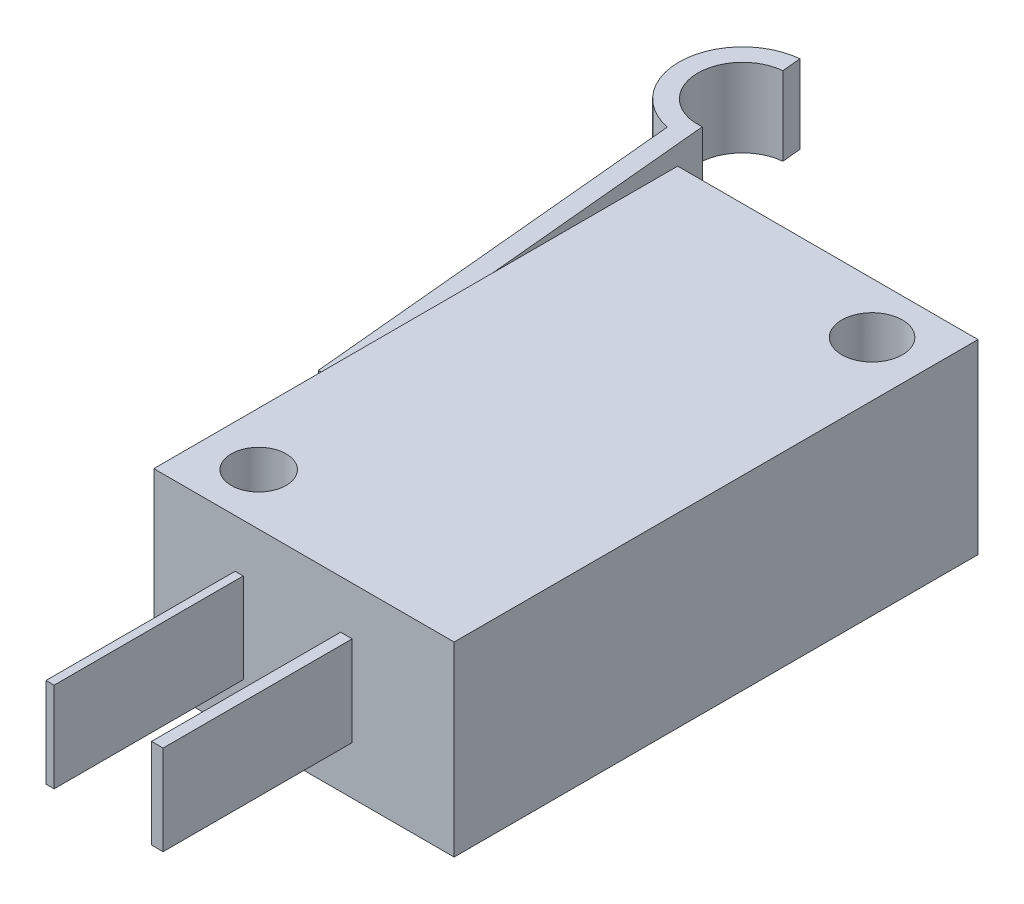
ISO-10303-21;
HEADER;
FILE_DESCRIPTION(('STEP AP214'),'2;1');
FILE_NAME('part.step','',(''),(''),'','','');
FILE_SCHEMA(('AUTOMOTIVE_DESIGN { 1 0 10303 214 1 1 1 1 }'));
ENDSEC;
DATA;
#1=APPLICATION_CONTEXT('core data for automotive mechanical design processes');
#2=APPLICATION_PROTOCOL_DEFINITION('international standard','automotive_design',2000,#1);
#3=PRODUCT_CONTEXT('',#1,'mechanical');
#4=PRODUCT('Part','Part','',(#3));
#5=PRODUCT_RELATED_PRODUCT_CATEGORY('part','',(#4));
#6=PRODUCT_DEFINITION_FORMATION('','',#4);
#7=PRODUCT_DEFINITION_CONTEXT('part definition',#1,'design');
#8=PRODUCT_DEFINITION('design','',#6,#7);
#9=PRODUCT_DEFINITION_SHAPE('','',#8);
#10=(LENGTH_UNIT() NAMED_UNIT(*) SI_UNIT(.MILLI.,.METRE.));
#11=(NAMED_UNIT(*) PLANE_ANGLE_UNIT() SI_UNIT($,.RADIAN.));
#12=(NAMED_UNIT(*) SI_UNIT($,.STERADIAN.) SOLID_ANGLE_UNIT());
#13=UNCERTAINTY_MEASURE_WITH_UNIT(LENGTH_MEASURE(1.E-05),#10,'distance_accuracy_value','');
#14=(GEOMETRIC_REPRESENTATION_CONTEXT(3) GLOBAL_UNCERTAINTY_ASSIGNED_CONTEXT((#13)) GLOBAL_UNIT_ASSIGNED_CONTEXT((#10,
#11,#12)) REPRESENTATION_CONTEXT('',''));
#15=CARTESIAN_POINT('',(0.,0.,0.));
#16=DIRECTION('',(0.,0.,1.));
#17=DIRECTION('',(1.,0.,0.));
#18=AXIS2_PLACEMENT_3D('',#15,#16,#17);
#19=CARTESIAN_POINT('',(-4.22086288071951,2.84999999999997,-35.3521896796628));
#20=DIRECTION('',(0.,1.,0.));
#21=DIRECTION('',(0.,0.,1.));
#22=AXIS2_PLACEMENT_3D('',#19,#20,#21);
#23=CYLINDRICAL_SURFACE('',#22,3.36253607405095);
#24=CARTESIAN_POINT('',(-4.22086288071951,6.99999999999997,-35.3521896796628));
#25=DIRECTION('',(0.,1.,0.));
#26=DIRECTION('',(0.,0.,1.));
#27=AXIS2_PLACEMENT_3D('',#24,#25,#26);
#28=CIRCLE('',#27,3.36253607405095);
#29=CARTESIAN_POINT('',(-4.53521126760563,6.99999999999997,-38.7));
#30=VERTEX_POINT('',#29);
#31=CARTESIAN_POINT('',(-4.91187053398898,6.99999999999998,-32.0614211869826));
#32=VERTEX_POINT('',#31);
#33=EDGE_CURVE('E221',#30,#32,#28,.T.);
#34=ORIENTED_EDGE('',*,*,#33,.F.);
#35=DIRECTION('',(0.,-1.,0.));
#36=VECTOR('',#35,1.);
#37=CARTESIAN_POINT('',(-4.53521126760563,9.85,-38.7));
#38=LINE('',#37,#36);
#39=CARTESIAN_POINT('',(-4.53521126760563,2.84999999999997,-38.7));
#40=VERTEX_POINT('',#39);
#41=EDGE_CURVE('E211',#30,#40,#38,.T.);
#42=ORIENTED_EDGE('',*,*,#41,.T.);
#43=CARTESIAN_POINT('',(-4.22086288071951,2.84999999999997,-35.3521896796628));
#44=DIRECTION('',(0.,1.,0.));
#45=DIRECTION('',(0.,0.,1.));
#46=AXIS2_PLACEMENT_3D('',#43,#44,#45);
#47=CIRCLE('',#46,3.36253607405095);
#48=CARTESIAN_POINT('',(-4.91187053398898,2.84999999999997,-32.0614211869826));
#49=VERTEX_POINT('',#48);
#50=EDGE_CURVE('E219',#40,#49,#47,.T.);
#51=ORIENTED_EDGE('',*,*,#50,.T.);
#52=DIRECTION('',(0.,1.,0.));
#53=VECTOR('',#52,1.);
#54=CARTESIAN_POINT('',(-4.91187053398898,2.84999999999997,-32.0614211869826));
#55=LINE('',#54,#53);
#56=EDGE_CURVE('E242',#32,#49,#55,.F.);
#57=ORIENTED_EDGE('',*,*,#56,.F.);
#58=EDGE_LOOP('',(#34,#42,#51,#57));
#59=FACE_BOUND('',#58,.T.);
#60=ADVANCED_FACE('F68',(#59),#23,.T.);
#61=CARTESIAN_POINT('',(-3.,2.85,-12.7));
#62=DIRECTION('',(0.,0.,1.));
#63=DIRECTION('',(1.,0.,0.));
#64=AXIS2_PLACEMENT_3D('',#61,#62,#63);
#65=PLANE('',#64);
#66=DIRECTION('',(0.,-1.,0.));
#67=VECTOR('',#66,1.);
#68=CARTESIAN_POINT('',(-2.09389671361502,2.85,-12.7));
#69=LINE('',#68,#67);
#70=CARTESIAN_POINT('',(-2.09389671361502,7.,-12.7));
#71=VERTEX_POINT('',#70);
#72=CARTESIAN_POINT('',(-2.09389671361502,2.85,-12.7));
#73=VERTEX_POINT('',#72);
#74=EDGE_CURVE('E90',#71,#73,#69,.T.);
#75=ORIENTED_EDGE('',*,*,#74,.F.);
#76=DIRECTION('',(1.,0.,0.));
#77=VECTOR('',#76,1.);
#78=CARTESIAN_POINT('',(-3.,7.,-12.7));
#79=LINE('',#78,#77);
#80=CARTESIAN_POINT('',(0.,7.,-12.7));
#81=VERTEX_POINT('',#80);
#82=EDGE_CURVE('E265',#71,#81,#79,.T.);
#83=ORIENTED_EDGE('',*,*,#82,.T.);
#84=DIRECTION('',(0.,-1.,0.));
#85=VECTOR('',#84,1.);
#86=CARTESIAN_POINT('',(0.,2.85,-12.7));
#87=LINE('',#86,#85);
#88=CARTESIAN_POINT('',(0.,2.85,-12.7));
#89=VERTEX_POINT('',#88);
#90=EDGE_CURVE('E257',#81,#89,#87,.T.);
#91=ORIENTED_EDGE('',*,*,#90,.T.);
#92=DIRECTION('',(1.,0.,0.));
#93=VECTOR('',#92,1.);
#94=CARTESIAN_POINT('',(-3.,2.85,-12.7));
#95=LINE('',#94,#93);
#96=EDGE_CURVE('E263',#73,#89,#95,.T.);
#97=ORIENTED_EDGE('',*,*,#96,.F.);
#98=EDGE_LOOP('',(#75,#83,#91,#97));
#99=FACE_BOUND('',#98,.T.);
#100=ADVANCED_FACE('F418',(#99),#65,.F.);
#101=CARTESIAN_POINT('',(0.,9.85,0.));
#102=DIRECTION('',(1.,0.,0.));
#103=DIRECTION('',(0.,0.,-1.));
#104=AXIS2_PLACEMENT_3D('',#101,#102,#103);
#105=PLANE('',#104);
#106=DIRECTION('',(0.,0.,1.));
#107=VECTOR('',#106,1.);
#108=CARTESIAN_POINT('',(0.,0.,0.));
#109=LINE('',#108,#107);
#110=CARTESIAN_POINT('',(0.,0.,-27.7));
#111=VERTEX_POINT('',#110);
#112=CARTESIAN_POINT('',(0.,0.,0.));
#113=VERTEX_POINT('',#112);
#114=EDGE_CURVE('E343',#111,#113,#109,.T.);
#115=ORIENTED_EDGE('',*,*,#114,.T.);
#116=DIRECTION('',(0.,-1.,0.));
#117=VECTOR('',#116,1.);
#118=CARTESIAN_POINT('',(0.,9.85,0.));
#119=LINE('',#118,#117);
#120=CARTESIAN_POINT('',(0.,9.85,0.));
#121=VERTEX_POINT('',#120);
#122=EDGE_CURVE('E76',#121,#113,#119,.T.);
#123=ORIENTED_EDGE('',*,*,#122,.F.);
#124=DIRECTION('',(0.,0.,1.));
#125=VECTOR('',#124,1.);
#126=CARTESIAN_POINT('',(0.,9.85,0.));
#127=LINE('',#126,#125);
#128=CARTESIAN_POINT('',(0.,9.85,-27.7));
#129=VERTEX_POINT('',#128);
#130=EDGE_CURVE('E344',#129,#121,#127,.T.);
#131=ORIENTED_EDGE('',*,*,#130,.F.);
#132=DIRECTION('',(0.,-1.,0.));
#133=VECTOR('',#132,1.);
#134=CARTESIAN_POINT('',(0.,9.85,-27.7));
#135=LINE('',#134,#133);
#136=EDGE_CURVE('E354',#129,#111,#135,.T.);
#137=ORIENTED_EDGE('',*,*,#136,.T.);
#138=EDGE_LOOP('',(#115,#123,#131,#137));
#139=FACE_BOUND('',#138,.T.);
#140=DIRECTION('',(0.,1.,0.));
#141=VECTOR('',#140,1.);
#142=CARTESIAN_POINT('',(0.,2.85,-11.7));
#143=LINE('',#142,#141);
#144=CARTESIAN_POINT('',(0.,2.85,-11.7));
#145=VERTEX_POINT('',#144);
#146=CARTESIAN_POINT('',(0.,7.,-11.7));
#147=VERTEX_POINT('',#146);
#148=EDGE_CURVE('E246',#145,#147,#143,.T.);
#149=ORIENTED_EDGE('',*,*,#148,.F.);
#150=DIRECTION('',(0.,0.,1.));
#151=VECTOR('',#150,1.);
#152=CARTESIAN_POINT('',(0.,2.85,-11.7));
#153=LINE('',#152,#151);
#154=EDGE_CURVE('E251',#89,#145,#153,.T.);
#155=ORIENTED_EDGE('',*,*,#154,.F.);
#156=ORIENTED_EDGE('',*,*,#90,.F.);
#157=DIRECTION('',(0.,0.,-1.));
#158=VECTOR('',#157,1.);
#159=CARTESIAN_POINT('',(0.,7.,-11.7));
#160=LINE('',#159,#158);
#161=EDGE_CURVE('E254',#147,#81,#160,.T.);
#162=ORIENTED_EDGE('',*,*,#161,.F.);
#163=EDGE_LOOP('',(#149,#155,#156,#162));
#164=FACE_BOUND('',#163,.T.);
#165=ADVANCED_FACE('F70',(#139,#164),#105,.F.);
#166=CARTESIAN_POINT('',(0.,9.85,0.));
#167=DIRECTION('',(0.,0.,-1.));
#168=DIRECTION('',(-1.,0.,0.));
#169=AXIS2_PLACEMENT_3D('',#166,#167,#168);
#170=PLANE('',#169);
#171=DIRECTION('',(0.,-1.,0.));
#172=VECTOR('',#171,1.);
#173=CARTESIAN_POINT('',(9.88,7.3,0.));
#174=LINE('',#173,#172);
#175=CARTESIAN_POINT('',(9.88,7.3,0.));
#176=VERTEX_POINT('',#175);
#177=CARTESIAN_POINT('',(9.88,2.55,0.));
#178=VERTEX_POINT('',#177);
#179=EDGE_CURVE('E310',#176,#178,#174,.T.);
#180=ORIENTED_EDGE('',*,*,#179,.F.);
#181=DIRECTION('',(-1.,0.,0.));
#182=VECTOR('',#181,1.);
#183=CARTESIAN_POINT('',(9.88,7.3,0.));
#184=LINE('',#183,#182);
#185=CARTESIAN_POINT('',(10.49,7.3,0.));
#186=VERTEX_POINT('',#185);
#187=EDGE_CURVE('E315',#186,#176,#184,.T.);
#188=ORIENTED_EDGE('',*,*,#187,.F.);
#189=DIRECTION('',(0.,1.,0.));
#190=VECTOR('',#189,1.);
#191=CARTESIAN_POINT('',(10.49,7.3,0.));
#192=LINE('',#191,#190);
#193=CARTESIAN_POINT('',(10.49,2.55,0.));
#194=VERTEX_POINT('',#193);
#195=EDGE_CURVE('E327',#194,#186,#192,.T.);
#196=ORIENTED_EDGE('',*,*,#195,.F.);
#197=DIRECTION('',(1.,0.,0.));
#198=VECTOR('',#197,1.);
#199=CARTESIAN_POINT('',(9.88,2.55,0.));
#200=LINE('',#199,#198);
#201=EDGE_CURVE('E324',#178,#194,#200,.T.);
#202=ORIENTED_EDGE('',*,*,#201,.F.);
#203=EDGE_LOOP('',(#180,#188,#196,#202));
#204=FACE_BOUND('',#203,.T.);
#205=DIRECTION('',(1.,0.,0.));
#206=VECTOR('',#205,1.);
#207=CARTESIAN_POINT('',(0.,0.,0.));
#208=LINE('',#207,#206);
#209=CARTESIAN_POINT('',(15.88,0.,0.));
#210=VERTEX_POINT('',#209);
#211=EDGE_CURVE('E357',#113,#210,#208,.T.);
#212=ORIENTED_EDGE('',*,*,#211,.T.);
#213=DIRECTION('',(0.,-1.,0.));
#214=VECTOR('',#213,1.);
#215=CARTESIAN_POINT('',(15.88,9.85,0.));
#216=LINE('',#215,#214);
#217=CARTESIAN_POINT('',(15.88,9.85,0.));
#218=VERTEX_POINT('',#217);
#219=EDGE_CURVE('E367',#218,#210,#216,.T.);
#220=ORIENTED_EDGE('',*,*,#219,.F.);
#221=DIRECTION('',(1.,0.,0.));
#222=VECTOR('',#221,1.);
#223=CARTESIAN_POINT('',(0.,9.85,0.));
#224=LINE('',#223,#222);
#225=EDGE_CURVE('E347',#121,#218,#224,.T.);
#226=ORIENTED_EDGE('',*,*,#225,.F.);
#227=ORIENTED_EDGE('',*,*,#122,.T.);
#228=EDGE_LOOP('',(#212,#220,#226,#227));
#229=FACE_BOUND('',#228,.T.);
#230=DIRECTION('',(0.,1.,0.));
#231=VECTOR('',#230,1.);
#232=CARTESIAN_POINT('',(4.73,7.3,0.));
#233=LINE('',#232,#231);
#234=CARTESIAN_POINT('',(4.73,2.55,0.));
#235=VERTEX_POINT('',#234);
#236=CARTESIAN_POINT('',(4.73,7.3,0.));
#237=VERTEX_POINT('',#236);
#238=EDGE_CURVE('E287',#235,#237,#233,.T.);
#239=ORIENTED_EDGE('',*,*,#238,.F.);
#240=DIRECTION('',(1.,0.,0.));
#241=VECTOR('',#240,1.);
#242=CARTESIAN_POINT('',(4.73,2.55,0.));
#243=LINE('',#242,#241);
#244=CARTESIAN_POINT('',(4.3,2.55,0.));
#245=VERTEX_POINT('',#244);
#246=EDGE_CURVE('E280',#245,#235,#243,.T.);
#247=ORIENTED_EDGE('',*,*,#246,.F.);
#248=DIRECTION('',(0.,-1.,0.));
#249=VECTOR('',#248,1.);
#250=CARTESIAN_POINT('',(4.3,7.3,0.));
#251=LINE('',#250,#249);
#252=CARTESIAN_POINT('',(4.3,7.3,0.));
#253=VERTEX_POINT('',#252);
#254=EDGE_CURVE('E294',#253,#245,#251,.T.);
#255=ORIENTED_EDGE('',*,*,#254,.F.);
#256=DIRECTION('',(-1.,0.,0.));
#257=VECTOR('',#256,1.);
#258=CARTESIAN_POINT('',(4.73,7.3,0.));
#259=LINE('',#258,#257);
#260=EDGE_CURVE('E290',#237,#253,#259,.T.);
#261=ORIENTED_EDGE('',*,*,#260,.F.);
#262=EDGE_LOOP('',(#239,#247,#255,#261));
#263=FACE_BOUND('',#262,.T.);
#264=ADVANCED_FACE('F404',(#204,#229,#263),#170,.F.);
#265=CARTESIAN_POINT('',(15.88,9.85,0.));
#266=DIRECTION('',(-1.,0.,0.));
#267=DIRECTION('',(0.,0.,1.));
#268=AXIS2_PLACEMENT_3D('',#265,#266,#267);
#269=PLANE('',#268);
#270=DIRECTION('',(0.,0.,-1.));
#271=VECTOR('',#270,1.);
#272=CARTESIAN_POINT('',(15.88,0.,0.));
#273=LINE('',#272,#271);
#274=CARTESIAN_POINT('',(15.88,0.,-27.7));
#275=VERTEX_POINT('',#274);
#276=EDGE_CURVE('E359',#210,#275,#273,.T.);
#277=ORIENTED_EDGE('',*,*,#276,.T.);
#278=DIRECTION('',(0.,-1.,0.));
#279=VECTOR('',#278,1.);
#280=CARTESIAN_POINT('',(15.88,9.85,-27.7));
#281=LINE('',#280,#279);
#282=CARTESIAN_POINT('',(15.88,9.85,-27.7));
#283=VERTEX_POINT('',#282);
#284=EDGE_CURVE('E364',#283,#275,#281,.T.);
#285=ORIENTED_EDGE('',*,*,#284,.F.);
#286=DIRECTION('',(0.,0.,-1.));
#287=VECTOR('',#286,1.);
#288=CARTESIAN_POINT('',(15.88,9.85,0.));
#289=LINE('',#288,#287);
#290=EDGE_CURVE('E350',#218,#283,#289,.T.);
#291=ORIENTED_EDGE('',*,*,#290,.F.);
#292=ORIENTED_EDGE('',*,*,#219,.T.);
#293=EDGE_LOOP('',(#277,#285,#291,#292));
#294=FACE_BOUND('',#293,.T.);
#295=ADVANCED_FACE('F401',(#294),#269,.F.);
#296=CARTESIAN_POINT('',(0.,9.85,-27.7));
#297=DIRECTION('',(0.,0.,1.));
#298=DIRECTION('',(1.,0.,0.));
#299=AXIS2_PLACEMENT_3D('',#296,#297,#298);
#300=PLANE('',#299);
#301=DIRECTION('',(-1.,0.,0.));
#302=VECTOR('',#301,1.);
#303=CARTESIAN_POINT('',(0.,0.,-27.7));
#304=LINE('',#303,#302);
#305=EDGE_CURVE('E348',#275,#111,#304,.T.);
#306=ORIENTED_EDGE('',*,*,#305,.T.);
#307=ORIENTED_EDGE('',*,*,#136,.F.);
#308=DIRECTION('',(-1.,0.,0.));
#309=VECTOR('',#308,1.);
#310=CARTESIAN_POINT('',(0.,9.85,-27.7));
#311=LINE('',#310,#309);
#312=EDGE_CURVE('E352',#283,#129,#311,.T.);
#313=ORIENTED_EDGE('',*,*,#312,.F.);
#314=ORIENTED_EDGE('',*,*,#284,.T.);
#315=EDGE_LOOP('',(#306,#307,#313,#314));
#316=FACE_BOUND('',#315,.T.);
#317=ADVANCED_FACE('F397',(#316),#300,.F.);
#318=CARTESIAN_POINT('',(0.,9.85,0.));
#319=DIRECTION('',(0.,-1.,0.));
#320=DIRECTION('',(0.,0.,-1.));
#321=AXIS2_PLACEMENT_3D('',#318,#319,#320);
#322=PLANE('',#321);
#323=CARTESIAN_POINT('',(2.82,9.85,-2.725));
#324=DIRECTION('',(0.,1.,0.));
#325=DIRECTION('',(0.,0.,1.));
#326=AXIS2_PLACEMENT_3D('',#323,#324,#325);
#327=CIRCLE('',#326,1.45);
#328=CARTESIAN_POINT('',(2.82,9.85,-1.275));
#329=VERTEX_POINT('',#328);
#330=EDGE_CURVE('E270',#329,#329,#327,.T.);
#331=ORIENTED_EDGE('',*,*,#330,.F.);
#332=EDGE_LOOP('',(#331));
#333=FACE_BOUND('',#332,.T.);
#334=CARTESIAN_POINT('',(12.98,9.85,-25.));
#335=DIRECTION('',(0.,1.,0.));
#336=DIRECTION('',(0.,0.,1.));
#337=AXIS2_PLACEMENT_3D('',#334,#335,#336);
#338=CIRCLE('',#337,1.6);
#339=CARTESIAN_POINT('',(12.98,9.85,-23.4));
#340=VERTEX_POINT('',#339);
#341=EDGE_CURVE('E269',#340,#340,#338,.T.);
#342=ORIENTED_EDGE('',*,*,#341,.F.);
#343=EDGE_LOOP('',(#342));
#344=FACE_BOUND('',#343,.T.);
#345=ORIENTED_EDGE('',*,*,#130,.T.);
#346=ORIENTED_EDGE('',*,*,#225,.T.);
#347=ORIENTED_EDGE('',*,*,#290,.T.);
#348=ORIENTED_EDGE('',*,*,#312,.T.);
#349=EDGE_LOOP('',(#345,#346,#347,#348));
#350=FACE_BOUND('',#349,.T.);
#351=ADVANCED_FACE('F383',(#333,#344,#350),#322,.F.);
#352=CARTESIAN_POINT('',(0.,0.,0.));
#353=DIRECTION('',(0.,-1.,0.));
#354=DIRECTION('',(0.,0.,-1.));
#355=AXIS2_PLACEMENT_3D('',#352,#353,#354);
#356=PLANE('',#355);
#357=CARTESIAN_POINT('',(2.82,0.,-2.725));
#358=DIRECTION('',(0.,-1.,0.));
#359=DIRECTION('',(0.,0.,-1.));
#360=AXIS2_PLACEMENT_3D('',#357,#358,#359);
#361=CIRCLE('',#360,1.45);
#362=CARTESIAN_POINT('',(2.82,0.,-4.175));
#363=VERTEX_POINT('',#362);
#364=EDGE_CURVE('E291',#363,#363,#361,.T.);
#365=ORIENTED_EDGE('',*,*,#364,.F.);
#366=EDGE_LOOP('',(#365));
#367=FACE_BOUND('',#366,.T.);
#368=CARTESIAN_POINT('',(12.98,0.,-25.));
#369=DIRECTION('',(0.,-1.,0.));
#370=DIRECTION('',(0.,0.,-1.));
#371=AXIS2_PLACEMENT_3D('',#368,#369,#370);
#372=CIRCLE('',#371,1.6);
#373=CARTESIAN_POINT('',(12.98,0.,-26.6));
#374=VERTEX_POINT('',#373);
#375=EDGE_CURVE('E273',#374,#374,#372,.T.);
#376=ORIENTED_EDGE('',*,*,#375,.F.);
#377=EDGE_LOOP('',(#376));
#378=FACE_BOUND('',#377,.T.);
#379=ORIENTED_EDGE('',*,*,#114,.F.);
#380=ORIENTED_EDGE('',*,*,#305,.F.);
#381=ORIENTED_EDGE('',*,*,#276,.F.);
#382=ORIENTED_EDGE('',*,*,#211,.F.);
#383=EDGE_LOOP('',(#379,#380,#381,#382));
#384=FACE_BOUND('',#383,.T.);
#385=ADVANCED_FACE('F379',(#367,#378,#384),#356,.T.);
#386=CARTESIAN_POINT('',(9.88,7.3,10.));
#387=DIRECTION('',(1.,0.,0.));
#388=DIRECTION('',(0.,0.,-1.));
#389=AXIS2_PLACEMENT_3D('',#386,#387,#388);
#390=PLANE('',#389);
#391=ORIENTED_EDGE('',*,*,#179,.T.);
#392=DIRECTION('',(0.,0.,-1.));
#393=VECTOR('',#392,1.);
#394=CARTESIAN_POINT('',(9.88,2.55,10.));
#395=LINE('',#394,#393);
#396=CARTESIAN_POINT('',(9.88,2.55,10.));
#397=VERTEX_POINT('',#396);
#398=EDGE_CURVE('E340',#397,#178,#395,.T.);
#399=ORIENTED_EDGE('',*,*,#398,.F.);
#400=DIRECTION('',(0.,-1.,0.));
#401=VECTOR('',#400,1.);
#402=CARTESIAN_POINT('',(9.88,7.3,10.));
#403=LINE('',#402,#401);
#404=CARTESIAN_POINT('',(9.88,7.3,10.));
#405=VERTEX_POINT('',#404);
#406=EDGE_CURVE('E311',#405,#397,#403,.T.);
#407=ORIENTED_EDGE('',*,*,#406,.F.);
#408=DIRECTION('',(0.,0.,-1.));
#409=VECTOR('',#408,1.);
#410=CARTESIAN_POINT('',(9.88,7.3,10.));
#411=LINE('',#410,#409);
#412=EDGE_CURVE('E321',#405,#176,#411,.T.);
#413=ORIENTED_EDGE('',*,*,#412,.T.);
#414=EDGE_LOOP('',(#391,#399,#407,#413));
#415=FACE_BOUND('',#414,.T.);
#416=ADVANCED_FACE('F382',(#415),#390,.F.);
#417=CARTESIAN_POINT('',(9.88,2.55,10.));
#418=DIRECTION('',(0.,1.,0.));
#419=DIRECTION('',(-1.,0.,0.));
#420=AXIS2_PLACEMENT_3D('',#417,#418,#419);
#421=PLANE('',#420);
#422=ORIENTED_EDGE('',*,*,#201,.T.);
#423=DIRECTION('',(0.,0.,-1.));
#424=VECTOR('',#423,1.);
#425=CARTESIAN_POINT('',(10.49,2.55,10.));
#426=LINE('',#425,#424);
#427=CARTESIAN_POINT('',(10.49,2.55,10.));
#428=VERTEX_POINT('',#427);
#429=EDGE_CURVE('E337',#428,#194,#426,.T.);
#430=ORIENTED_EDGE('',*,*,#429,.F.);
#431=DIRECTION('',(1.,0.,0.));
#432=VECTOR('',#431,1.);
#433=CARTESIAN_POINT('',(9.88,2.55,10.));
#434=LINE('',#433,#432);
#435=EDGE_CURVE('E314',#397,#428,#434,.T.);
#436=ORIENTED_EDGE('',*,*,#435,.F.);
#437=ORIENTED_EDGE('',*,*,#398,.T.);
#438=EDGE_LOOP('',(#422,#430,#436,#437));
#439=FACE_BOUND('',#438,.T.);
#440=ADVANCED_FACE('F476',(#439),#421,.F.);
#441=CARTESIAN_POINT('',(10.49,7.3,10.));
#442=DIRECTION('',(-1.,0.,0.));
#443=DIRECTION('',(0.,0.,1.));
#444=AXIS2_PLACEMENT_3D('',#441,#442,#443);
#445=PLANE('',#444);
#446=ORIENTED_EDGE('',*,*,#195,.T.);
#447=DIRECTION('',(0.,0.,-1.));
#448=VECTOR('',#447,1.);
#449=CARTESIAN_POINT('',(10.49,7.3,10.));
#450=LINE('',#449,#448);
#451=CARTESIAN_POINT('',(10.49,7.3,10.));
#452=VERTEX_POINT('',#451);
#453=EDGE_CURVE('E334',#452,#186,#450,.T.);
#454=ORIENTED_EDGE('',*,*,#453,.F.);
#455=DIRECTION('',(0.,1.,0.));
#456=VECTOR('',#455,1.);
#457=CARTESIAN_POINT('',(10.49,7.3,10.));
#458=LINE('',#457,#456);
#459=EDGE_CURVE('E317',#428,#452,#458,.T.);
#460=ORIENTED_EDGE('',*,*,#459,.F.);
#461=ORIENTED_EDGE('',*,*,#429,.T.);
#462=EDGE_LOOP('',(#446,#454,#460,#461));
#463=FACE_BOUND('',#462,.T.);
#464=ADVANCED_FACE('F472',(#463),#445,.F.);
#465=CARTESIAN_POINT('',(9.88,7.3,10.));
#466=DIRECTION('',(0.,-1.,0.));
#467=DIRECTION('',(0.,0.,-1.));
#468=AXIS2_PLACEMENT_3D('',#465,#466,#467);
#469=PLANE('',#468);
#470=ORIENTED_EDGE('',*,*,#187,.T.);
#471=ORIENTED_EDGE('',*,*,#412,.F.);
#472=DIRECTION('',(-1.,0.,0.));
#473=VECTOR('',#472,1.);
#474=CARTESIAN_POINT('',(9.88,7.3,10.));
#475=LINE('',#474,#473);
#476=EDGE_CURVE('E319',#452,#405,#475,.T.);
#477=ORIENTED_EDGE('',*,*,#476,.F.);
#478=ORIENTED_EDGE('',*,*,#453,.T.);
#479=EDGE_LOOP('',(#470,#471,#477,#478));
#480=FACE_BOUND('',#479,.T.);
#481=ADVANCED_FACE('F468',(#480),#469,.F.);
#482=CARTESIAN_POINT('',(0.,0.,10.));
#483=DIRECTION('',(0.,0.,1.));
#484=DIRECTION('',(1.,0.,0.));
#485=AXIS2_PLACEMENT_3D('',#482,#483,#484);
#486=PLANE('',#485);
#487=ORIENTED_EDGE('',*,*,#406,.T.);
#488=ORIENTED_EDGE('',*,*,#435,.T.);
#489=ORIENTED_EDGE('',*,*,#459,.T.);
#490=ORIENTED_EDGE('',*,*,#476,.T.);
#491=EDGE_LOOP('',(#487,#488,#489,#490));
#492=FACE_BOUND('',#491,.T.);
#493=ADVANCED_FACE('F464',(#492),#486,.T.);
#494=CARTESIAN_POINT('',(4.73,7.3,10.));
#495=DIRECTION('',(-1.,0.,0.));
#496=DIRECTION('',(0.,0.,1.));
#497=AXIS2_PLACEMENT_3D('',#494,#495,#496);
#498=PLANE('',#497);
#499=ORIENTED_EDGE('',*,*,#238,.T.);
#500=DIRECTION('',(0.,0.,-1.));
#501=VECTOR('',#500,1.);
#502=CARTESIAN_POINT('',(4.73,7.3,10.));
#503=LINE('',#502,#501);
#504=CARTESIAN_POINT('',(4.73,7.3,10.));
#505=VERTEX_POINT('',#504);
#506=EDGE_CURVE('E307',#505,#237,#503,.T.);
#507=ORIENTED_EDGE('',*,*,#506,.F.);
#508=DIRECTION('',(0.,1.,0.));
#509=VECTOR('',#508,1.);
#510=CARTESIAN_POINT('',(4.73,7.3,10.));
#511=LINE('',#510,#509);
#512=CARTESIAN_POINT('',(4.73,2.55,10.));
#513=VERTEX_POINT('',#512);
#514=EDGE_CURVE('E276',#513,#505,#511,.T.);
#515=ORIENTED_EDGE('',*,*,#514,.F.);
#516=DIRECTION('',(0.,0.,-1.));
#517=VECTOR('',#516,1.);
#518=CARTESIAN_POINT('',(4.73,2.55,10.));
#519=LINE('',#518,#517);
#520=EDGE_CURVE('E286',#513,#235,#519,.T.);
#521=ORIENTED_EDGE('',*,*,#520,.T.);
#522=EDGE_LOOP('',(#499,#507,#515,#521));
#523=FACE_BOUND('',#522,.T.);
#524=ADVANCED_FACE('F460',(#523),#498,.F.);
#525=CARTESIAN_POINT('',(4.73,7.3,10.));
#526=DIRECTION('',(0.,-1.,0.));
#527=DIRECTION('',(0.,0.,-1.));
#528=AXIS2_PLACEMENT_3D('',#525,#526,#527);
#529=PLANE('',#528);
#530=ORIENTED_EDGE('',*,*,#260,.T.);
#531=DIRECTION('',(0.,0.,-1.));
#532=VECTOR('',#531,1.);
#533=CARTESIAN_POINT('',(4.3,7.3,10.));
#534=LINE('',#533,#532);
#535=CARTESIAN_POINT('',(4.3,7.3,10.));
#536=VERTEX_POINT('',#535);
#537=EDGE_CURVE('E304',#536,#253,#534,.T.);
#538=ORIENTED_EDGE('',*,*,#537,.F.);
#539=DIRECTION('',(-1.,0.,0.));
#540=VECTOR('',#539,1.);
#541=CARTESIAN_POINT('',(4.73,7.3,10.));
#542=LINE('',#541,#540);
#543=EDGE_CURVE('E279',#505,#536,#542,.T.);
#544=ORIENTED_EDGE('',*,*,#543,.F.);
#545=ORIENTED_EDGE('',*,*,#506,.T.);
#546=EDGE_LOOP('',(#530,#538,#544,#545));
#547=FACE_BOUND('',#546,.T.);
#548=ADVANCED_FACE('F456',(#547),#529,.F.);
#549=CARTESIAN_POINT('',(4.3,7.3,10.));
#550=DIRECTION('',(1.,0.,0.));
#551=DIRECTION('',(0.,0.,-1.));
#552=AXIS2_PLACEMENT_3D('',#549,#550,#551);
#553=PLANE('',#552);
#554=ORIENTED_EDGE('',*,*,#254,.T.);
#555=DIRECTION('',(0.,0.,-1.));
#556=VECTOR('',#555,1.);
#557=CARTESIAN_POINT('',(4.3,2.55,10.));
#558=LINE('',#557,#556);
#559=CARTESIAN_POINT('',(4.3,2.55,10.));
#560=VERTEX_POINT('',#559);
#561=EDGE_CURVE('E301',#560,#245,#558,.T.);
#562=ORIENTED_EDGE('',*,*,#561,.F.);
#563=DIRECTION('',(0.,-1.,0.));
#564=VECTOR('',#563,1.);
#565=CARTESIAN_POINT('',(4.3,7.3,10.));
#566=LINE('',#565,#564);
#567=EDGE_CURVE('E282',#536,#560,#566,.T.);
#568=ORIENTED_EDGE('',*,*,#567,.F.);
#569=ORIENTED_EDGE('',*,*,#537,.T.);
#570=EDGE_LOOP('',(#554,#562,#568,#569));
#571=FACE_BOUND('',#570,.T.);
#572=ADVANCED_FACE('F452',(#571),#553,.F.);
#573=CARTESIAN_POINT('',(4.73,2.55,10.));
#574=DIRECTION('',(0.,1.,0.));
#575=DIRECTION('',(-1.,0.,0.));
#576=AXIS2_PLACEMENT_3D('',#573,#574,#575);
#577=PLANE('',#576);
#578=ORIENTED_EDGE('',*,*,#246,.T.);
#579=ORIENTED_EDGE('',*,*,#520,.F.);
#580=DIRECTION('',(1.,0.,0.));
#581=VECTOR('',#580,1.);
#582=CARTESIAN_POINT('',(4.73,2.55,10.));
#583=LINE('',#582,#581);
#584=EDGE_CURVE('E284',#560,#513,#583,.T.);
#585=ORIENTED_EDGE('',*,*,#584,.F.);
#586=ORIENTED_EDGE('',*,*,#561,.T.);
#587=EDGE_LOOP('',(#578,#579,#585,#586));
#588=FACE_BOUND('',#587,.T.);
#589=ADVANCED_FACE('F448',(#588),#577,.F.);
#590=CARTESIAN_POINT('',(0.,0.,10.));
#591=DIRECTION('',(0.,0.,-1.));
#592=DIRECTION('',(-1.,0.,0.));
#593=AXIS2_PLACEMENT_3D('',#590,#591,#592);
#594=PLANE('',#593);
#595=ORIENTED_EDGE('',*,*,#514,.T.);
#596=ORIENTED_EDGE('',*,*,#543,.T.);
#597=ORIENTED_EDGE('',*,*,#567,.T.);
#598=ORIENTED_EDGE('',*,*,#584,.T.);
#599=EDGE_LOOP('',(#595,#596,#597,#598));
#600=FACE_BOUND('',#599,.T.);
#601=ADVANCED_FACE('F444',(#600),#594,.F.);
#602=CARTESIAN_POINT('',(12.98,-0.150000000000001,-25.));
#603=DIRECTION('',(0.,1.,0.));
#604=DIRECTION('',(0.,0.,1.));
#605=AXIS2_PLACEMENT_3D('',#602,#603,#604);
#606=CYLINDRICAL_SURFACE('',#605,1.6);
#607=ORIENTED_EDGE('',*,*,#375,.T.);
#608=EDGE_LOOP('',(#607));
#609=FACE_BOUND('',#608,.T.);
#610=ORIENTED_EDGE('',*,*,#341,.T.);
#611=EDGE_LOOP('',(#610));
#612=FACE_BOUND('',#611,.T.);
#613=ADVANCED_FACE('F441',(#609,#612),#606,.F.);
#614=CARTESIAN_POINT('',(2.82,-0.150000000000001,-2.725));
#615=DIRECTION('',(0.,1.,0.));
#616=DIRECTION('',(0.,0.,1.));
#617=AXIS2_PLACEMENT_3D('',#614,#615,#616);
#618=CYLINDRICAL_SURFACE('',#617,1.45);
#619=ORIENTED_EDGE('',*,*,#364,.T.);
#620=EDGE_LOOP('',(#619));
#621=FACE_BOUND('',#620,.T.);
#622=ORIENTED_EDGE('',*,*,#330,.T.);
#623=EDGE_LOOP('',(#622));
#624=FACE_BOUND('',#623,.T.);
#625=ADVANCED_FACE('F376',(#621,#624),#618,.F.);
#626=CARTESIAN_POINT('',(-3.,2.85,-11.7));
#627=DIRECTION('',(0.,0.,-1.));
#628=DIRECTION('',(-1.,0.,0.));
#629=AXIS2_PLACEMENT_3D('',#626,#627,#628);
#630=PLANE('',#629);
#631=DIRECTION('',(1.,0.,0.));
#632=VECTOR('',#631,1.);
#633=CARTESIAN_POINT('',(-3.,2.85,-11.7));
#634=LINE('',#633,#632);
#635=CARTESIAN_POINT('',(-3.,2.84999999999999,-11.7));
#636=VERTEX_POINT('',#635);
#637=EDGE_CURVE('E250',#636,#145,#634,.T.);
#638=ORIENTED_EDGE('',*,*,#637,.T.);
#639=ORIENTED_EDGE('',*,*,#148,.T.);
#640=DIRECTION('',(1.,0.,0.));
#641=VECTOR('',#640,1.);
#642=CARTESIAN_POINT('',(-3.,7.,-11.7));
#643=LINE('',#642,#641);
#644=CARTESIAN_POINT('',(-3.,7.,-11.7));
#645=VERTEX_POINT('',#644);
#646=EDGE_CURVE('E267',#645,#147,#643,.T.);
#647=ORIENTED_EDGE('',*,*,#646,.F.);
#648=DIRECTION('',(0.,1.,0.));
#649=VECTOR('',#648,1.);
#650=CARTESIAN_POINT('',(-3.,2.85,-11.7));
#651=LINE('',#650,#649);
#652=EDGE_CURVE('E247',#636,#645,#651,.T.);
#653=ORIENTED_EDGE('',*,*,#652,.F.);
#654=EDGE_LOOP('',(#638,#639,#647,#653));
#655=FACE_BOUND('',#654,.T.);
#656=ADVANCED_FACE('F434',(#655),#630,.F.);
#657=CARTESIAN_POINT('',(-3.,7.,-11.7));
#658=DIRECTION('',(0.,-1.,0.));
#659=DIRECTION('',(0.,0.,-1.));
#660=AXIS2_PLACEMENT_3D('',#657,#658,#659);
#661=PLANE('',#660);
#662=DIRECTION('',(0.0934855061666042,0.,0.995620640674335));
#663=VECTOR('',#662,1.);
#664=CARTESIAN_POINT('',(-4.,6.99999999999997,-33.));
#665=LINE('',#664,#663);
#666=CARTESIAN_POINT('',(-4.,6.99999999999997,-33.));
#667=VERTEX_POINT('',#666);
#668=EDGE_CURVE('E588',#667,#71,#665,.T.);
#669=ORIENTED_EDGE('',*,*,#668,.F.);
#670=DIRECTION('',(1.,0.,0.));
#671=VECTOR('',#670,1.);
#672=CARTESIAN_POINT('',(-5.,6.99999999999997,-33.));
#673=LINE('',#672,#671);
#674=CARTESIAN_POINT('',(-4.4417257614391,6.99999999999997,-33.));
#675=VERTEX_POINT('',#674);
#676=EDGE_CURVE('E231',#675,#667,#673,.T.);
#677=ORIENTED_EDGE('',*,*,#676,.F.);
#678=CARTESIAN_POINT('',(-4.22086288071951,6.99999999999997,-35.3521896796628));
#679=DIRECTION('',(0.,1.,0.));
#680=DIRECTION('',(0.,0.,1.));
#681=AXIS2_PLACEMENT_3D('',#678,#679,#680);
#682=CIRCLE('',#681,2.36253607405095);
#683=CARTESIAN_POINT('',(-4.44172576143903,6.99999999999997,-37.7043793593257));
#684=VERTEX_POINT('',#683);
#685=EDGE_CURVE('E236',#684,#675,#682,.T.);
#686=ORIENTED_EDGE('',*,*,#685,.F.);
#687=DIRECTION('',(-0.093485506166604,0.,-0.995620640674335));
#688=VECTOR('',#687,1.);
#689=CARTESIAN_POINT('',(-2.00873953986323,7.,-11.7930760995434));
#690=LINE('',#689,#688);
#691=EDGE_CURVE('E83',#684,#30,#690,.T.);
#692=ORIENTED_EDGE('',*,*,#691,.T.);
#693=ORIENTED_EDGE('',*,*,#33,.T.);
#694=DIRECTION('',(-0.0934855061666042,0.,-0.995620640674335));
#695=VECTOR('',#694,1.);
#696=CARTESIAN_POINT('',(-3.,6.99999999999999,-11.7));
#697=LINE('',#696,#695);
#698=EDGE_CURVE('E228',#645,#32,#697,.T.);
#699=ORIENTED_EDGE('',*,*,#698,.F.);
#700=ORIENTED_EDGE('',*,*,#646,.T.);
#701=ORIENTED_EDGE('',*,*,#161,.T.);
#702=ORIENTED_EDGE('',*,*,#82,.F.);
#703=EDGE_LOOP('',(#669,#677,#686,#692,#693,#699,#700,#701,#702));
#704=FACE_BOUND('',#703,.T.);
#705=ADVANCED_FACE('F430',(#704),#661,.F.);
#706=CARTESIAN_POINT('',(-3.,2.85,-11.7));
#707=DIRECTION('',(0.,1.,0.));
#708=DIRECTION('',(0.,0.,1.));
#709=AXIS2_PLACEMENT_3D('',#706,#707,#708);
#710=PLANE('',#709);
#711=ORIENTED_EDGE('',*,*,#50,.F.);
#712=DIRECTION('',(-0.093485506166604,0.,-0.995620640674335));
#713=VECTOR('',#712,1.);
#714=CARTESIAN_POINT('',(-3.9065144938334,2.84999999999998,-32.0043793593257));
#715=LINE('',#714,#713);
#716=CARTESIAN_POINT('',(-4.44172576143903,2.84999999999997,-37.7043793593257));
#717=VERTEX_POINT('',#716);
#718=EDGE_CURVE('E208',#717,#40,#715,.T.);
#719=ORIENTED_EDGE('',*,*,#718,.F.);
#720=CARTESIAN_POINT('',(-4.22086288071951,2.84999999999997,-35.3521896796628));
#721=DIRECTION('',(0.,1.,0.));
#722=DIRECTION('',(0.,0.,1.));
#723=AXIS2_PLACEMENT_3D('',#720,#721,#722);
#724=CIRCLE('',#723,2.36253607405095);
#725=CARTESIAN_POINT('',(-4.4417257614391,2.84999999999997,-33.));
#726=VERTEX_POINT('',#725);
#727=EDGE_CURVE('E233',#717,#726,#724,.T.);
#728=ORIENTED_EDGE('',*,*,#727,.T.);
#729=DIRECTION('',(1.,0.,0.));
#730=VECTOR('',#729,1.);
#731=CARTESIAN_POINT('',(-5.,2.84999999999997,-33.));
#732=LINE('',#731,#730);
#733=CARTESIAN_POINT('',(-4.,2.84999999999997,-33.));
#734=VERTEX_POINT('',#733);
#735=EDGE_CURVE('E595',#726,#734,#732,.T.);
#736=ORIENTED_EDGE('',*,*,#735,.T.);
#737=DIRECTION('',(0.0934855061666042,0.,0.995620640674335));
#738=VECTOR('',#737,1.);
#739=CARTESIAN_POINT('',(-4.,2.84999999999997,-33.));
#740=LINE('',#739,#738);
#741=EDGE_CURVE('E587',#734,#73,#740,.T.);
#742=ORIENTED_EDGE('',*,*,#741,.T.);
#743=ORIENTED_EDGE('',*,*,#96,.T.);
#744=ORIENTED_EDGE('',*,*,#154,.T.);
#745=ORIENTED_EDGE('',*,*,#637,.F.);
#746=DIRECTION('',(-0.0934855061666042,0.,-0.995620640674335));
#747=VECTOR('',#746,1.);
#748=CARTESIAN_POINT('',(-3.,2.84999999999999,-11.7));
#749=LINE('',#748,#747);
#750=EDGE_CURVE('E227',#636,#49,#749,.T.);
#751=ORIENTED_EDGE('',*,*,#750,.T.);
#752=EDGE_LOOP('',(#711,#719,#728,#736,#742,#743,#744,#745,#751));
#753=FACE_BOUND('',#752,.T.);
#754=ADVANCED_FACE('F224',(#753),#710,.F.);
#755=CARTESIAN_POINT('',(-4.,2.84999999999997,-33.));
#756=DIRECTION('',(-0.995620640674335,0.,0.0934855061666042));
#757=DIRECTION('',(0.0934855061666042,0.,0.995620640674335));
#758=AXIS2_PLACEMENT_3D('',#755,#756,#757);
#759=PLANE('',#758);
#760=ORIENTED_EDGE('',*,*,#668,.T.);
#761=ORIENTED_EDGE('',*,*,#74,.T.);
#762=ORIENTED_EDGE('',*,*,#741,.F.);
#763=DIRECTION('',(0.,1.,0.));
#764=VECTOR('',#763,1.);
#765=CARTESIAN_POINT('',(-4.,2.84999999999997,-33.));
#766=LINE('',#765,#764);
#767=EDGE_CURVE('E243',#734,#667,#766,.T.);
#768=ORIENTED_EDGE('',*,*,#767,.T.);
#769=EDGE_LOOP('',(#760,#761,#762,#768));
#770=FACE_BOUND('',#769,.T.);
#771=ADVANCED_FACE('F429',(#770),#759,.F.);
#772=CARTESIAN_POINT('',(-5.,2.84999999999997,-33.));
#773=DIRECTION('',(0.,0.,1.));
#774=DIRECTION('',(0.,-1.,0.));
#775=AXIS2_PLACEMENT_3D('',#772,#773,#774);
#776=PLANE('',#775);
#777=DIRECTION('',(0.,1.,0.));
#778=VECTOR('',#777,1.);
#779=CARTESIAN_POINT('',(-4.4417257614391,2.84999999999997,-33.));
#780=LINE('',#779,#778);
#781=EDGE_CURVE('E239',#675,#726,#780,.F.);
#782=ORIENTED_EDGE('',*,*,#781,.F.);
#783=ORIENTED_EDGE('',*,*,#676,.T.);
#784=ORIENTED_EDGE('',*,*,#767,.F.);
#785=ORIENTED_EDGE('',*,*,#735,.F.);
#786=EDGE_LOOP('',(#782,#783,#784,#785));
#787=FACE_BOUND('',#786,.T.);
#788=ADVANCED_FACE('F523',(#787),#776,.F.);
#789=CARTESIAN_POINT('',(-3.,2.84999999999999,-11.7));
#790=DIRECTION('',(0.995620640674335,0.,-0.0934855061666042));
#791=DIRECTION('',(-0.0934855061666042,0.,-0.995620640674335));
#792=AXIS2_PLACEMENT_3D('',#789,#790,#791);
#793=PLANE('',#792);
#794=ORIENTED_EDGE('',*,*,#698,.T.);
#795=ORIENTED_EDGE('',*,*,#56,.T.);
#796=ORIENTED_EDGE('',*,*,#750,.F.);
#797=ORIENTED_EDGE('',*,*,#652,.T.);
#798=EDGE_LOOP('',(#794,#795,#796,#797));
#799=FACE_BOUND('',#798,.T.);
#800=ADVANCED_FACE('F519',(#799),#793,.F.);
#801=CARTESIAN_POINT('',(-4.22086288071951,2.84999999999997,-35.3521896796628));
#802=DIRECTION('',(0.,1.,0.));
#803=DIRECTION('',(0.,0.,1.));
#804=AXIS2_PLACEMENT_3D('',#801,#802,#803);
#805=CYLINDRICAL_SURFACE('',#804,2.36253607405095);
#806=ORIENTED_EDGE('',*,*,#727,.F.);
#807=DIRECTION('',(0.,1.,0.));
#808=VECTOR('',#807,1.);
#809=CARTESIAN_POINT('',(-4.44172576143903,2.84999999999997,-37.7043793593257));
#810=LINE('',#809,#808);
#811=EDGE_CURVE('E12',#717,#684,#810,.T.);
#812=ORIENTED_EDGE('',*,*,#811,.T.);
#813=ORIENTED_EDGE('',*,*,#685,.T.);
#814=ORIENTED_EDGE('',*,*,#781,.T.);
#815=EDGE_LOOP('',(#806,#812,#813,#814));
#816=FACE_BOUND('',#815,.T.);
#817=ADVANCED_FACE('F426',(#816),#805,.F.);
#818=CARTESIAN_POINT('',(-3.9065144938334,9.85,-32.0043793593257));
#819=DIRECTION('',(-0.995620640674335,0.,0.093485506166604));
#820=DIRECTION('',(0.093485506166604,0.,0.995620640674335));
#821=AXIS2_PLACEMENT_3D('',#818,#819,#820);
#822=PLANE('',#821);
#823=ORIENTED_EDGE('',*,*,#811,.F.);
#824=ORIENTED_EDGE('',*,*,#718,.T.);
#825=ORIENTED_EDGE('',*,*,#41,.F.);
#826=ORIENTED_EDGE('',*,*,#691,.F.);
#827=EDGE_LOOP('',(#823,#824,#825,#826));
#828=FACE_BOUND('',#827,.T.);
#829=ADVANCED_FACE('F210',(#828),#822,.F.);
#830=CLOSED_SHELL('',(#60,#100,#165,#264,#295,#317,#351,#385,#416,#440,#464,#481,#493,#524,#548,
#572,#589,#601,#613,#625,#656,#705,#754,#771,#788,#800,#817,#829));
#831=MANIFOLD_SOLID_BREP('B2',#830);
#832=ADVANCED_BREP_SHAPE_REPRESENTATION('',(#18,#831),#14);
#833=SHAPE_DEFINITION_REPRESENTATION(#9,#832);
ENDSEC;
END-ISO-10303-21;
